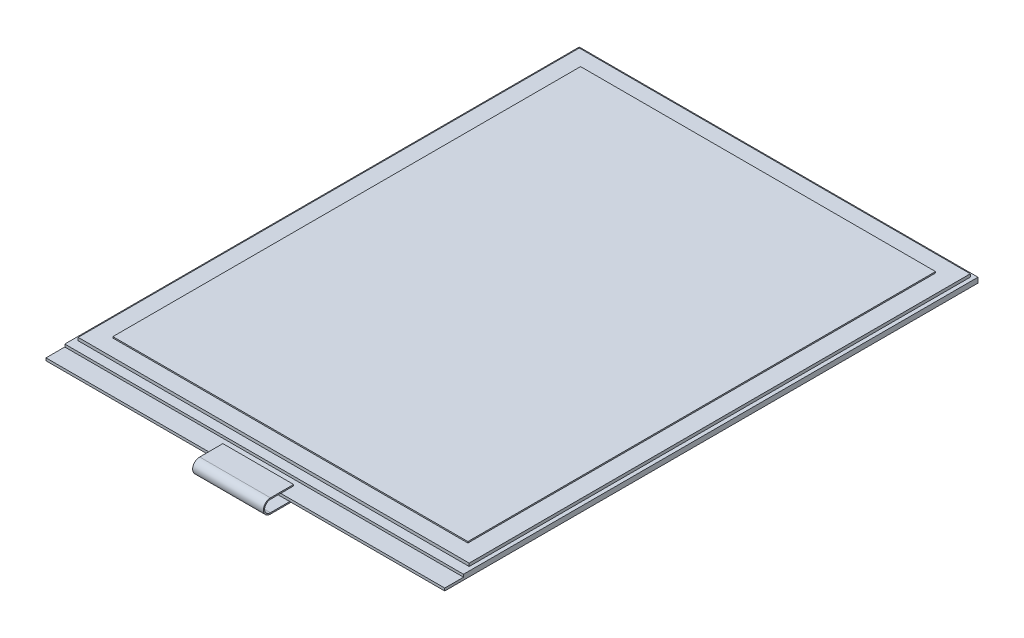
ISO-10303-21;
HEADER;
FILE_DESCRIPTION(('STEP AP214'),'2;1');
FILE_NAME('part.step','',(''),(''),'','','');
FILE_SCHEMA(('AUTOMOTIVE_DESIGN { 1 0 10303 214 1 1 1 1 }'));
ENDSEC;
DATA;
#1=APPLICATION_CONTEXT('core data for automotive mechanical design processes');
#2=APPLICATION_PROTOCOL_DEFINITION('international standard','automotive_design',2000,#1);
#3=PRODUCT_CONTEXT('',#1,'mechanical');
#4=PRODUCT('Part','Part','',(#3));
#5=PRODUCT_RELATED_PRODUCT_CATEGORY('part','',(#4));
#6=PRODUCT_DEFINITION_FORMATION('','',#4);
#7=PRODUCT_DEFINITION_CONTEXT('part definition',#1,'design');
#8=PRODUCT_DEFINITION('design','',#6,#7);
#9=PRODUCT_DEFINITION_SHAPE('','',#8);
#10=(LENGTH_UNIT() NAMED_UNIT(*) SI_UNIT(.MILLI.,.METRE.));
#11=(NAMED_UNIT(*) PLANE_ANGLE_UNIT() SI_UNIT($,.RADIAN.));
#12=(NAMED_UNIT(*) SI_UNIT($,.STERADIAN.) SOLID_ANGLE_UNIT());
#13=UNCERTAINTY_MEASURE_WITH_UNIT(LENGTH_MEASURE(1.E-05),#10,'distance_accuracy_value','');
#14=(GEOMETRIC_REPRESENTATION_CONTEXT(3) GLOBAL_UNCERTAINTY_ASSIGNED_CONTEXT((#13)) GLOBAL_UNIT_ASSIGNED_CONTEXT((#10,
#11,#12)) REPRESENTATION_CONTEXT('',''));
#15=CARTESIAN_POINT('',(0.,0.,0.));
#16=DIRECTION('',(0.,0.,1.));
#17=DIRECTION('',(1.,0.,0.));
#18=AXIS2_PLACEMENT_3D('',#15,#16,#17);
#19=CARTESIAN_POINT('',(0.,0.,0.));
#20=DIRECTION('',(0.,1.,0.));
#21=DIRECTION('',(0.,0.,1.));
#22=AXIS2_PLACEMENT_3D('',#19,#20,#21);
#23=PLANE('',#22);
#24=DIRECTION('',(0.,0.,-1.));
#25=VECTOR('',#24,1.);
#26=CARTESIAN_POINT('',(15.5,0.,-20.73));
#27=LINE('',#26,#25);
#28=CARTESIAN_POINT('',(15.5,0.,20.73));
#29=VERTEX_POINT('',#28);
#30=CARTESIAN_POINT('',(15.5,0.,-20.73));
#31=VERTEX_POINT('',#30);
#32=EDGE_CURVE('E379',#29,#31,#27,.T.);
#33=ORIENTED_EDGE('',*,*,#32,.F.);
#34=DIRECTION('',(1.,0.,0.));
#35=VECTOR('',#34,1.);
#36=CARTESIAN_POINT('',(-15.5,0.,20.73));
#37=LINE('',#36,#35);
#38=CARTESIAN_POINT('',(-15.5,0.,20.73));
#39=VERTEX_POINT('',#38);
#40=EDGE_CURVE('E383',#39,#29,#37,.T.);
#41=ORIENTED_EDGE('',*,*,#40,.F.);
#42=DIRECTION('',(0.,0.,1.));
#43=VECTOR('',#42,1.);
#44=CARTESIAN_POINT('',(-15.5,0.,-20.73));
#45=LINE('',#44,#43);
#46=CARTESIAN_POINT('',(-15.5,0.,-20.73));
#47=VERTEX_POINT('',#46);
#48=EDGE_CURVE('E395',#47,#39,#45,.T.);
#49=ORIENTED_EDGE('',*,*,#48,.F.);
#50=DIRECTION('',(-1.,0.,0.));
#51=VECTOR('',#50,1.);
#52=CARTESIAN_POINT('',(-15.5,0.,-20.73));
#53=LINE('',#52,#51);
#54=EDGE_CURVE('E393',#31,#47,#53,.T.);
#55=ORIENTED_EDGE('',*,*,#54,.F.);
#56=EDGE_LOOP('',(#33,#41,#49,#55));
#57=FACE_BOUND('',#56,.T.);
#58=DIRECTION('',(0.,0.,-1.));
#59=VECTOR('',#58,1.);
#60=CARTESIAN_POINT('',(-15.2,0.,-20.43));
#61=LINE('',#60,#59);
#62=CARTESIAN_POINT('',(-15.2,0.,18.53));
#63=VERTEX_POINT('',#62);
#64=CARTESIAN_POINT('',(-15.2,0.,-20.43));
#65=VERTEX_POINT('',#64);
#66=EDGE_CURVE('E293',#63,#65,#61,.T.);
#67=ORIENTED_EDGE('',*,*,#66,.F.);
#68=DIRECTION('',(-1.,0.,0.));
#69=VECTOR('',#68,1.);
#70=CARTESIAN_POINT('',(-15.2,0.,18.53));
#71=LINE('',#70,#69);
#72=CARTESIAN_POINT('',(15.2,0.,18.53));
#73=VERTEX_POINT('',#72);
#74=EDGE_CURVE('E298',#73,#63,#71,.T.);
#75=ORIENTED_EDGE('',*,*,#74,.F.);
#76=DIRECTION('',(0.,0.,1.));
#77=VECTOR('',#76,1.);
#78=CARTESIAN_POINT('',(15.2,0.,-20.43));
#79=LINE('',#78,#77);
#80=CARTESIAN_POINT('',(15.2,0.,-20.43));
#81=VERTEX_POINT('',#80);
#82=EDGE_CURVE('E310',#81,#73,#79,.T.);
#83=ORIENTED_EDGE('',*,*,#82,.F.);
#84=DIRECTION('',(1.,0.,0.));
#85=VECTOR('',#84,1.);
#86=CARTESIAN_POINT('',(-15.2,0.,-20.43));
#87=LINE('',#86,#85);
#88=EDGE_CURVE('E307',#65,#81,#87,.T.);
#89=ORIENTED_EDGE('',*,*,#88,.F.);
#90=EDGE_LOOP('',(#67,#75,#83,#89));
#91=FACE_BOUND('',#90,.T.);
#92=ADVANCED_FACE('F32',(#57,#91),#23,.F.);
#93=CARTESIAN_POINT('',(15.5,0.2,-20.73));
#94=DIRECTION('',(-1.,0.,0.));
#95=DIRECTION('',(0.,0.,1.));
#96=AXIS2_PLACEMENT_3D('',#93,#94,#95);
#97=PLANE('',#96);
#98=ORIENTED_EDGE('',*,*,#32,.T.);
#99=DIRECTION('',(0.,-1.,0.));
#100=VECTOR('',#99,1.);
#101=CARTESIAN_POINT('',(15.5,0.2,-20.73));
#102=LINE('',#101,#100);
#103=CARTESIAN_POINT('',(15.5,0.4,-20.73));
#104=VERTEX_POINT('',#103);
#105=EDGE_CURVE('E406',#104,#31,#102,.T.);
#106=ORIENTED_EDGE('',*,*,#105,.F.);
#107=DIRECTION('',(0.,0.,-1.));
#108=VECTOR('',#107,1.);
#109=CARTESIAN_POINT('',(15.5,0.4,-20.73));
#110=LINE('',#109,#108);
#111=CARTESIAN_POINT('',(15.5,0.4,19.27));
#112=VERTEX_POINT('',#111);
#113=EDGE_CURVE('E365',#112,#104,#110,.T.);
#114=ORIENTED_EDGE('',*,*,#113,.F.);
#115=DIRECTION('',(0.,-1.,0.));
#116=VECTOR('',#115,1.);
#117=CARTESIAN_POINT('',(15.5,0.4,19.27));
#118=LINE('',#117,#116);
#119=CARTESIAN_POINT('',(15.5,0.2,19.27));
#120=VERTEX_POINT('',#119);
#121=EDGE_CURVE('E371',#112,#120,#118,.T.);
#122=ORIENTED_EDGE('',*,*,#121,.T.);
#123=DIRECTION('',(0.,0.,-1.));
#124=VECTOR('',#123,1.);
#125=CARTESIAN_POINT('',(15.5,0.2,-20.73));
#126=LINE('',#125,#124);
#127=CARTESIAN_POINT('',(15.5,0.2,20.73));
#128=VERTEX_POINT('',#127);
#129=EDGE_CURVE('E380',#128,#120,#126,.T.);
#130=ORIENTED_EDGE('',*,*,#129,.F.);
#131=DIRECTION('',(0.,-1.,0.));
#132=VECTOR('',#131,1.);
#133=CARTESIAN_POINT('',(15.5,0.2,20.73));
#134=LINE('',#133,#132);
#135=EDGE_CURVE('E389',#128,#29,#134,.T.);
#136=ORIENTED_EDGE('',*,*,#135,.T.);
#137=EDGE_LOOP('',(#98,#106,#114,#122,#130,#136));
#138=FACE_BOUND('',#137,.T.);
#139=ADVANCED_FACE('F34',(#138),#97,.F.);
#140=CARTESIAN_POINT('',(-15.5,0.2,-20.73));
#141=DIRECTION('',(0.,0.,1.));
#142=DIRECTION('',(1.,0.,0.));
#143=AXIS2_PLACEMENT_3D('',#140,#141,#142);
#144=PLANE('',#143);
#145=ORIENTED_EDGE('',*,*,#54,.T.);
#146=DIRECTION('',(0.,-1.,0.));
#147=VECTOR('',#146,1.);
#148=CARTESIAN_POINT('',(-15.5,0.2,-20.73));
#149=LINE('',#148,#147);
#150=CARTESIAN_POINT('',(-15.5,0.4,-20.73));
#151=VERTEX_POINT('',#150);
#152=EDGE_CURVE('E403',#151,#47,#149,.T.);
#153=ORIENTED_EDGE('',*,*,#152,.F.);
#154=DIRECTION('',(-1.,0.,0.));
#155=VECTOR('',#154,1.);
#156=CARTESIAN_POINT('',(-15.5,0.4,-20.73));
#157=LINE('',#156,#155);
#158=EDGE_CURVE('E368',#104,#151,#157,.T.);
#159=ORIENTED_EDGE('',*,*,#158,.F.);
#160=ORIENTED_EDGE('',*,*,#105,.T.);
#161=EDGE_LOOP('',(#145,#153,#159,#160));
#162=FACE_BOUND('',#161,.T.);
#163=ADVANCED_FACE('F449',(#162),#144,.F.);
#164=CARTESIAN_POINT('',(-15.5,0.2,-20.73));
#165=DIRECTION('',(1.,0.,0.));
#166=DIRECTION('',(0.,0.,-1.));
#167=AXIS2_PLACEMENT_3D('',#164,#165,#166);
#168=PLANE('',#167);
#169=ORIENTED_EDGE('',*,*,#48,.T.);
#170=DIRECTION('',(0.,-1.,0.));
#171=VECTOR('',#170,1.);
#172=CARTESIAN_POINT('',(-15.5,0.2,20.73));
#173=LINE('',#172,#171);
#174=CARTESIAN_POINT('',(-15.5,0.2,20.73));
#175=VERTEX_POINT('',#174);
#176=EDGE_CURVE('E400',#175,#39,#173,.T.);
#177=ORIENTED_EDGE('',*,*,#176,.F.);
#178=DIRECTION('',(0.,0.,1.));
#179=VECTOR('',#178,1.);
#180=CARTESIAN_POINT('',(-15.5,0.2,-20.73));
#181=LINE('',#180,#179);
#182=CARTESIAN_POINT('',(-15.5,0.2,19.27));
#183=VERTEX_POINT('',#182);
#184=EDGE_CURVE('E382',#183,#175,#181,.T.);
#185=ORIENTED_EDGE('',*,*,#184,.F.);
#186=DIRECTION('',(0.,-1.,0.));
#187=VECTOR('',#186,1.);
#188=CARTESIAN_POINT('',(-15.5,0.4,19.27));
#189=LINE('',#188,#187);
#190=CARTESIAN_POINT('',(-15.5,0.4,19.27));
#191=VERTEX_POINT('',#190);
#192=EDGE_CURVE('E376',#191,#183,#189,.T.);
#193=ORIENTED_EDGE('',*,*,#192,.F.);
#194=DIRECTION('',(0.,0.,1.));
#195=VECTOR('',#194,1.);
#196=CARTESIAN_POINT('',(-15.5,0.4,-20.73));
#197=LINE('',#196,#195);
#198=EDGE_CURVE('E360',#151,#191,#197,.T.);
#199=ORIENTED_EDGE('',*,*,#198,.F.);
#200=ORIENTED_EDGE('',*,*,#152,.T.);
#201=EDGE_LOOP('',(#169,#177,#185,#193,#199,#200));
#202=FACE_BOUND('',#201,.T.);
#203=ADVANCED_FACE('F440',(#202),#168,.F.);
#204=CARTESIAN_POINT('',(-15.5,0.2,20.73));
#205=DIRECTION('',(0.,0.,-1.));
#206=DIRECTION('',(-1.,0.,0.));
#207=AXIS2_PLACEMENT_3D('',#204,#205,#206);
#208=PLANE('',#207);
#209=ORIENTED_EDGE('',*,*,#40,.T.);
#210=ORIENTED_EDGE('',*,*,#135,.F.);
#211=DIRECTION('',(1.,0.,0.));
#212=VECTOR('',#211,1.);
#213=CARTESIAN_POINT('',(-15.5,0.2,20.73));
#214=LINE('',#213,#212);
#215=CARTESIAN_POINT('',(2.75,0.2,20.73));
#216=VERTEX_POINT('',#215);
#217=EDGE_CURVE('E385',#216,#128,#214,.T.);
#218=ORIENTED_EDGE('',*,*,#217,.F.);
#219=CARTESIAN_POINT('',(-2.75,0.2,20.73));
#220=VERTEX_POINT('',#219);
#221=EDGE_CURVE('E390',#220,#216,#214,.T.);
#222=ORIENTED_EDGE('',*,*,#221,.F.);
#223=EDGE_CURVE('E386',#175,#220,#214,.T.);
#224=ORIENTED_EDGE('',*,*,#223,.F.);
#225=ORIENTED_EDGE('',*,*,#176,.T.);
#226=EDGE_LOOP('',(#209,#210,#218,#222,#224,#225));
#227=FACE_BOUND('',#226,.T.);
#228=ADVANCED_FACE('F426',(#227),#208,.F.);
#229=CARTESIAN_POINT('',(0.,0.2,0.));
#230=DIRECTION('',(0.,1.,0.));
#231=DIRECTION('',(0.,0.,1.));
#232=AXIS2_PLACEMENT_3D('',#229,#230,#231);
#233=PLANE('',#232);
#234=DIRECTION('',(0.,0.,-1.));
#235=VECTOR('',#234,1.);
#236=CARTESIAN_POINT('',(2.75,0.2,0.));
#237=LINE('',#236,#235);
#238=CARTESIAN_POINT('',(2.75,0.2,19.73));
#239=VERTEX_POINT('',#238);
#240=EDGE_CURVE('E11',#216,#239,#237,.T.);
#241=ORIENTED_EDGE('',*,*,#240,.F.);
#242=ORIENTED_EDGE('',*,*,#217,.T.);
#243=ORIENTED_EDGE('',*,*,#129,.T.);
#244=DIRECTION('',(1.,0.,0.));
#245=VECTOR('',#244,1.);
#246=CARTESIAN_POINT('',(-15.5,0.2,19.27));
#247=LINE('',#246,#245);
#248=EDGE_CURVE('E359',#183,#120,#247,.T.);
#249=ORIENTED_EDGE('',*,*,#248,.F.);
#250=ORIENTED_EDGE('',*,*,#184,.T.);
#251=ORIENTED_EDGE('',*,*,#223,.T.);
#252=DIRECTION('',(0.,0.,-1.));
#253=VECTOR('',#252,1.);
#254=CARTESIAN_POINT('',(-2.75,0.2,0.));
#255=LINE('',#254,#253);
#256=CARTESIAN_POINT('',(-2.75,0.2,19.73));
#257=VERTEX_POINT('',#256);
#258=EDGE_CURVE('E40',#220,#257,#255,.T.);
#259=ORIENTED_EDGE('',*,*,#258,.T.);
#260=DIRECTION('',(-1.,0.,0.));
#261=VECTOR('',#260,1.);
#262=CARTESIAN_POINT('',(2.75,0.2,19.73));
#263=LINE('',#262,#261);
#264=EDGE_CURVE('E291',#239,#257,#263,.T.);
#265=ORIENTED_EDGE('',*,*,#264,.F.);
#266=EDGE_LOOP('',(#241,#242,#243,#249,#250,#251,#259,#265));
#267=FACE_BOUND('',#266,.T.);
#268=ADVANCED_FACE('F412',(#267),#233,.T.);
#269=CARTESIAN_POINT('',(-15.5,0.4,19.27));
#270=DIRECTION('',(0.,0.,-1.));
#271=DIRECTION('',(-1.,0.,0.));
#272=AXIS2_PLACEMENT_3D('',#269,#270,#271);
#273=PLANE('',#272);
#274=ORIENTED_EDGE('',*,*,#248,.T.);
#275=ORIENTED_EDGE('',*,*,#121,.F.);
#276=DIRECTION('',(1.,0.,0.));
#277=VECTOR('',#276,1.);
#278=CARTESIAN_POINT('',(-15.5,0.4,19.27));
#279=LINE('',#278,#277);
#280=EDGE_CURVE('E363',#191,#112,#279,.T.);
#281=ORIENTED_EDGE('',*,*,#280,.F.);
#282=ORIENTED_EDGE('',*,*,#192,.T.);
#283=EDGE_LOOP('',(#274,#275,#281,#282));
#284=FACE_BOUND('',#283,.T.);
#285=ADVANCED_FACE('F435',(#284),#273,.F.);
#286=CARTESIAN_POINT('',(0.,0.4,0.));
#287=DIRECTION('',(0.,1.,0.));
#288=DIRECTION('',(0.,0.,1.));
#289=AXIS2_PLACEMENT_3D('',#286,#287,#288);
#290=PLANE('',#289);
#291=DIRECTION('',(0.,0.,1.));
#292=VECTOR('',#291,1.);
#293=CARTESIAN_POINT('',(-15.2,0.4,-20.43));
#294=LINE('',#293,#292);
#295=CARTESIAN_POINT('',(-15.2,0.4,-20.43));
#296=VERTEX_POINT('',#295);
#297=CARTESIAN_POINT('',(-15.2,0.4,18.53));
#298=VERTEX_POINT('',#297);
#299=EDGE_CURVE('E326',#296,#298,#294,.T.);
#300=ORIENTED_EDGE('',*,*,#299,.F.);
#301=DIRECTION('',(-1.,0.,0.));
#302=VECTOR('',#301,1.);
#303=CARTESIAN_POINT('',(-15.2,0.4,-20.43));
#304=LINE('',#303,#302);
#305=CARTESIAN_POINT('',(15.2,0.4,-20.43));
#306=VERTEX_POINT('',#305);
#307=EDGE_CURVE('E331',#306,#296,#304,.T.);
#308=ORIENTED_EDGE('',*,*,#307,.F.);
#309=DIRECTION('',(0.,0.,-1.));
#310=VECTOR('',#309,1.);
#311=CARTESIAN_POINT('',(15.2,0.4,-20.43));
#312=LINE('',#311,#310);
#313=CARTESIAN_POINT('',(15.2,0.4,18.53));
#314=VERTEX_POINT('',#313);
#315=EDGE_CURVE('E343',#314,#306,#312,.T.);
#316=ORIENTED_EDGE('',*,*,#315,.F.);
#317=DIRECTION('',(1.,0.,0.));
#318=VECTOR('',#317,1.);
#319=CARTESIAN_POINT('',(-15.2,0.4,18.53));
#320=LINE('',#319,#318);
#321=EDGE_CURVE('E340',#298,#314,#320,.T.);
#322=ORIENTED_EDGE('',*,*,#321,.F.);
#323=EDGE_LOOP('',(#300,#308,#316,#322));
#324=FACE_BOUND('',#323,.T.);
#325=ORIENTED_EDGE('',*,*,#198,.T.);
#326=ORIENTED_EDGE('',*,*,#280,.T.);
#327=ORIENTED_EDGE('',*,*,#113,.T.);
#328=ORIENTED_EDGE('',*,*,#158,.T.);
#329=EDGE_LOOP('',(#325,#326,#327,#328));
#330=FACE_BOUND('',#329,.T.);
#331=ADVANCED_FACE('F448',(#324,#330),#290,.T.);
#332=CARTESIAN_POINT('',(-15.2,0.63,-20.43));
#333=DIRECTION('',(1.,0.,0.));
#334=DIRECTION('',(0.,0.,-1.));
#335=AXIS2_PLACEMENT_3D('',#332,#333,#334);
#336=PLANE('',#335);
#337=ORIENTED_EDGE('',*,*,#299,.T.);
#338=DIRECTION('',(0.,-1.,0.));
#339=VECTOR('',#338,1.);
#340=CARTESIAN_POINT('',(-15.2,0.63,18.53));
#341=LINE('',#340,#339);
#342=CARTESIAN_POINT('',(-15.2,0.63,18.53));
#343=VERTEX_POINT('',#342);
#344=EDGE_CURVE('E356',#343,#298,#341,.T.);
#345=ORIENTED_EDGE('',*,*,#344,.F.);
#346=DIRECTION('',(0.,0.,1.));
#347=VECTOR('',#346,1.);
#348=CARTESIAN_POINT('',(-15.2,0.63,-20.43));
#349=LINE('',#348,#347);
#350=CARTESIAN_POINT('',(-15.2,0.63,-20.43));
#351=VERTEX_POINT('',#350);
#352=EDGE_CURVE('E327',#351,#343,#349,.T.);
#353=ORIENTED_EDGE('',*,*,#352,.F.);
#354=DIRECTION('',(0.,-1.,0.));
#355=VECTOR('',#354,1.);
#356=CARTESIAN_POINT('',(-15.2,0.63,-20.43));
#357=LINE('',#356,#355);
#358=EDGE_CURVE('E337',#351,#296,#357,.T.);
#359=ORIENTED_EDGE('',*,*,#358,.T.);
#360=EDGE_LOOP('',(#337,#345,#353,#359));
#361=FACE_BOUND('',#360,.T.);
#362=ADVANCED_FACE('F473',(#361),#336,.F.);
#363=CARTESIAN_POINT('',(-15.2,0.63,18.53));
#364=DIRECTION('',(0.,0.,-1.));
#365=DIRECTION('',(-1.,0.,0.));
#366=AXIS2_PLACEMENT_3D('',#363,#364,#365);
#367=PLANE('',#366);
#368=ORIENTED_EDGE('',*,*,#321,.T.);
#369=DIRECTION('',(0.,-1.,0.));
#370=VECTOR('',#369,1.);
#371=CARTESIAN_POINT('',(15.2,0.63,18.53));
#372=LINE('',#371,#370);
#373=CARTESIAN_POINT('',(15.2,0.63,18.53));
#374=VERTEX_POINT('',#373);
#375=EDGE_CURVE('E353',#374,#314,#372,.T.);
#376=ORIENTED_EDGE('',*,*,#375,.F.);
#377=DIRECTION('',(1.,0.,0.));
#378=VECTOR('',#377,1.);
#379=CARTESIAN_POINT('',(-15.2,0.63,18.53));
#380=LINE('',#379,#378);
#381=EDGE_CURVE('E330',#343,#374,#380,.T.);
#382=ORIENTED_EDGE('',*,*,#381,.F.);
#383=ORIENTED_EDGE('',*,*,#344,.T.);
#384=EDGE_LOOP('',(#368,#376,#382,#383));
#385=FACE_BOUND('',#384,.T.);
#386=ADVANCED_FACE('F479',(#385),#367,.F.);
#387=CARTESIAN_POINT('',(15.2,0.63,-20.43));
#388=DIRECTION('',(-1.,0.,0.));
#389=DIRECTION('',(0.,0.,1.));
#390=AXIS2_PLACEMENT_3D('',#387,#388,#389);
#391=PLANE('',#390);
#392=ORIENTED_EDGE('',*,*,#315,.T.);
#393=DIRECTION('',(0.,-1.,0.));
#394=VECTOR('',#393,1.);
#395=CARTESIAN_POINT('',(15.2,0.63,-20.43));
#396=LINE('',#395,#394);
#397=CARTESIAN_POINT('',(15.2,0.63,-20.43));
#398=VERTEX_POINT('',#397);
#399=EDGE_CURVE('E350',#398,#306,#396,.T.);
#400=ORIENTED_EDGE('',*,*,#399,.F.);
#401=DIRECTION('',(0.,0.,-1.));
#402=VECTOR('',#401,1.);
#403=CARTESIAN_POINT('',(15.2,0.63,-20.43));
#404=LINE('',#403,#402);
#405=EDGE_CURVE('E333',#374,#398,#404,.T.);
#406=ORIENTED_EDGE('',*,*,#405,.F.);
#407=ORIENTED_EDGE('',*,*,#375,.T.);
#408=EDGE_LOOP('',(#392,#400,#406,#407));
#409=FACE_BOUND('',#408,.T.);
#410=ADVANCED_FACE('F483',(#409),#391,.F.);
#411=CARTESIAN_POINT('',(-15.2,0.63,-20.43));
#412=DIRECTION('',(0.,0.,1.));
#413=DIRECTION('',(1.,0.,0.));
#414=AXIS2_PLACEMENT_3D('',#411,#412,#413);
#415=PLANE('',#414);
#416=ORIENTED_EDGE('',*,*,#307,.T.);
#417=ORIENTED_EDGE('',*,*,#358,.F.);
#418=DIRECTION('',(-1.,0.,0.));
#419=VECTOR('',#418,1.);
#420=CARTESIAN_POINT('',(-15.2,0.63,-20.43));
#421=LINE('',#420,#419);
#422=EDGE_CURVE('E335',#398,#351,#421,.T.);
#423=ORIENTED_EDGE('',*,*,#422,.F.);
#424=ORIENTED_EDGE('',*,*,#399,.T.);
#425=EDGE_LOOP('',(#416,#417,#423,#424));
#426=FACE_BOUND('',#425,.T.);
#427=ADVANCED_FACE('F487',(#426),#415,.F.);
#428=CARTESIAN_POINT('',(0.,0.63,0.));
#429=DIRECTION('',(0.,1.,0.));
#430=DIRECTION('',(0.,0.,1.));
#431=AXIS2_PLACEMENT_3D('',#428,#429,#430);
#432=PLANE('',#431);
#433=DIRECTION('',(0.,0.,-1.));
#434=VECTOR('',#433,1.);
#435=CARTESIAN_POINT('',(13.8,0.63,-19.13));
#436=LINE('',#435,#434);
#437=CARTESIAN_POINT('',(13.8,0.63,17.23));
#438=VERTEX_POINT('',#437);
#439=CARTESIAN_POINT('',(13.8,0.63,-19.13));
#440=VERTEX_POINT('',#439);
#441=EDGE_CURVE('E47',#438,#440,#436,.T.);
#442=ORIENTED_EDGE('',*,*,#441,.F.);
#443=DIRECTION('',(1.,0.,0.));
#444=VECTOR('',#443,1.);
#445=CARTESIAN_POINT('',(-13.8,0.63,17.23));
#446=LINE('',#445,#444);
#447=CARTESIAN_POINT('',(-13.8,0.63,17.23));
#448=VERTEX_POINT('',#447);
#449=EDGE_CURVE('E51',#448,#438,#446,.T.);
#450=ORIENTED_EDGE('',*,*,#449,.F.);
#451=DIRECTION('',(0.,0.,1.));
#452=VECTOR('',#451,1.);
#453=CARTESIAN_POINT('',(-13.8,0.63,-19.13));
#454=LINE('',#453,#452);
#455=CARTESIAN_POINT('',(-13.8,0.63,-19.13));
#456=VERTEX_POINT('',#455);
#457=EDGE_CURVE('E767',#456,#448,#454,.T.);
#458=ORIENTED_EDGE('',*,*,#457,.F.);
#459=DIRECTION('',(-1.,0.,0.));
#460=VECTOR('',#459,1.);
#461=CARTESIAN_POINT('',(-13.8,0.63,-19.13));
#462=LINE('',#461,#460);
#463=EDGE_CURVE('E773',#440,#456,#462,.T.);
#464=ORIENTED_EDGE('',*,*,#463,.F.);
#465=EDGE_LOOP('',(#442,#450,#458,#464));
#466=FACE_BOUND('',#465,.T.);
#467=ORIENTED_EDGE('',*,*,#352,.T.);
#468=ORIENTED_EDGE('',*,*,#381,.T.);
#469=ORIENTED_EDGE('',*,*,#405,.T.);
#470=ORIENTED_EDGE('',*,*,#422,.T.);
#471=EDGE_LOOP('',(#467,#468,#469,#470));
#472=FACE_BOUND('',#471,.T.);
#473=ADVANCED_FACE('F491',(#466,#472),#432,.T.);
#474=CARTESIAN_POINT('',(-15.2,-0.115,-20.43));
#475=DIRECTION('',(1.,0.,0.));
#476=DIRECTION('',(0.,0.,-1.));
#477=AXIS2_PLACEMENT_3D('',#474,#475,#476);
#478=PLANE('',#477);
#479=ORIENTED_EDGE('',*,*,#66,.T.);
#480=DIRECTION('',(0.,1.,0.));
#481=VECTOR('',#480,1.);
#482=CARTESIAN_POINT('',(-15.2,-0.115,-20.43));
#483=LINE('',#482,#481);
#484=CARTESIAN_POINT('',(-15.2,-0.115,-20.43));
#485=VERTEX_POINT('',#484);
#486=EDGE_CURVE('E323',#485,#65,#483,.T.);
#487=ORIENTED_EDGE('',*,*,#486,.F.);
#488=DIRECTION('',(0.,0.,-1.));
#489=VECTOR('',#488,1.);
#490=CARTESIAN_POINT('',(-15.2,-0.115,-20.43));
#491=LINE('',#490,#489);
#492=CARTESIAN_POINT('',(-15.2,-0.115,18.53));
#493=VERTEX_POINT('',#492);
#494=EDGE_CURVE('E294',#493,#485,#491,.T.);
#495=ORIENTED_EDGE('',*,*,#494,.F.);
#496=DIRECTION('',(0.,1.,0.));
#497=VECTOR('',#496,1.);
#498=CARTESIAN_POINT('',(-15.2,-0.115,18.53));
#499=LINE('',#498,#497);
#500=EDGE_CURVE('E304',#493,#63,#499,.T.);
#501=ORIENTED_EDGE('',*,*,#500,.T.);
#502=EDGE_LOOP('',(#479,#487,#495,#501));
#503=FACE_BOUND('',#502,.T.);
#504=ADVANCED_FACE('F495',(#503),#478,.F.);
#505=CARTESIAN_POINT('',(-15.2,-0.115,-20.43));
#506=DIRECTION('',(0.,0.,1.));
#507=DIRECTION('',(1.,0.,0.));
#508=AXIS2_PLACEMENT_3D('',#505,#506,#507);
#509=PLANE('',#508);
#510=ORIENTED_EDGE('',*,*,#88,.T.);
#511=DIRECTION('',(0.,1.,0.));
#512=VECTOR('',#511,1.);
#513=CARTESIAN_POINT('',(15.2,-0.115,-20.43));
#514=LINE('',#513,#512);
#515=CARTESIAN_POINT('',(15.2,-0.115,-20.43));
#516=VERTEX_POINT('',#515);
#517=EDGE_CURVE('E320',#516,#81,#514,.T.);
#518=ORIENTED_EDGE('',*,*,#517,.F.);
#519=DIRECTION('',(1.,0.,0.));
#520=VECTOR('',#519,1.);
#521=CARTESIAN_POINT('',(-15.2,-0.115,-20.43));
#522=LINE('',#521,#520);
#523=EDGE_CURVE('E297',#485,#516,#522,.T.);
#524=ORIENTED_EDGE('',*,*,#523,.F.);
#525=ORIENTED_EDGE('',*,*,#486,.T.);
#526=EDGE_LOOP('',(#510,#518,#524,#525));
#527=FACE_BOUND('',#526,.T.);
#528=ADVANCED_FACE('F498',(#527),#509,.F.);
#529=CARTESIAN_POINT('',(15.2,-0.115,-20.43));
#530=DIRECTION('',(-1.,0.,0.));
#531=DIRECTION('',(0.,0.,1.));
#532=AXIS2_PLACEMENT_3D('',#529,#530,#531);
#533=PLANE('',#532);
#534=ORIENTED_EDGE('',*,*,#82,.T.);
#535=DIRECTION('',(0.,1.,0.));
#536=VECTOR('',#535,1.);
#537=CARTESIAN_POINT('',(15.2,-0.115,18.53));
#538=LINE('',#537,#536);
#539=CARTESIAN_POINT('',(15.2,-0.115,18.53));
#540=VERTEX_POINT('',#539);
#541=EDGE_CURVE('E317',#540,#73,#538,.T.);
#542=ORIENTED_EDGE('',*,*,#541,.F.);
#543=DIRECTION('',(0.,0.,1.));
#544=VECTOR('',#543,1.);
#545=CARTESIAN_POINT('',(15.2,-0.115,-20.43));
#546=LINE('',#545,#544);
#547=EDGE_CURVE('E300',#516,#540,#546,.T.);
#548=ORIENTED_EDGE('',*,*,#547,.F.);
#549=ORIENTED_EDGE('',*,*,#517,.T.);
#550=EDGE_LOOP('',(#534,#542,#548,#549));
#551=FACE_BOUND('',#550,.T.);
#552=ADVANCED_FACE('F502',(#551),#533,.F.);
#553=CARTESIAN_POINT('',(-15.2,-0.115,18.53));
#554=DIRECTION('',(0.,0.,-1.));
#555=DIRECTION('',(-1.,0.,0.));
#556=AXIS2_PLACEMENT_3D('',#553,#554,#555);
#557=PLANE('',#556);
#558=ORIENTED_EDGE('',*,*,#74,.T.);
#559=ORIENTED_EDGE('',*,*,#500,.F.);
#560=DIRECTION('',(-1.,0.,0.));
#561=VECTOR('',#560,1.);
#562=CARTESIAN_POINT('',(-15.2,-0.115,18.53));
#563=LINE('',#562,#561);
#564=EDGE_CURVE('E302',#540,#493,#563,.T.);
#565=ORIENTED_EDGE('',*,*,#564,.F.);
#566=ORIENTED_EDGE('',*,*,#541,.T.);
#567=EDGE_LOOP('',(#558,#559,#565,#566));
#568=FACE_BOUND('',#567,.T.);
#569=ADVANCED_FACE('F506',(#568),#557,.F.);
#570=CARTESIAN_POINT('',(0.,-0.115,0.));
#571=DIRECTION('',(0.,1.,0.));
#572=DIRECTION('',(0.,0.,1.));
#573=AXIS2_PLACEMENT_3D('',#570,#571,#572);
#574=PLANE('',#573);
#575=ORIENTED_EDGE('',*,*,#494,.T.);
#576=ORIENTED_EDGE('',*,*,#523,.T.);
#577=ORIENTED_EDGE('',*,*,#547,.T.);
#578=ORIENTED_EDGE('',*,*,#564,.T.);
#579=EDGE_LOOP('',(#575,#576,#577,#578));
#580=FACE_BOUND('',#579,.T.);
#581=ADVANCED_FACE('F510',(#580),#574,.F.);
#582=CARTESIAN_POINT('',(2.75,0.2,20.73));
#583=DIRECTION('',(0.,1.,0.));
#584=DIRECTION('',(0.,0.,1.));
#585=AXIS2_PLACEMENT_3D('',#582,#583,#584);
#586=PLANE('',#585);
#587=DIRECTION('',(0.,0.,-1.));
#588=VECTOR('',#587,1.);
#589=CARTESIAN_POINT('',(-2.75,0.2,20.73));
#590=LINE('',#589,#588);
#591=CARTESIAN_POINT('',(-2.75,0.2,21.53));
#592=VERTEX_POINT('',#591);
#593=EDGE_CURVE('E242',#592,#220,#590,.T.);
#594=ORIENTED_EDGE('',*,*,#593,.T.);
#595=ORIENTED_EDGE('',*,*,#221,.T.);
#596=DIRECTION('',(0.,0.,-1.));
#597=VECTOR('',#596,1.);
#598=CARTESIAN_POINT('',(2.75,0.2,19.73));
#599=LINE('',#598,#597);
#600=CARTESIAN_POINT('',(2.75,0.2,21.53));
#601=VERTEX_POINT('',#600);
#602=EDGE_CURVE('E238',#601,#216,#599,.T.);
#603=ORIENTED_EDGE('',*,*,#602,.F.);
#604=DIRECTION('',(-1.,0.,0.));
#605=VECTOR('',#604,1.);
#606=CARTESIAN_POINT('',(2.75,0.2,21.53));
#607=LINE('',#606,#605);
#608=EDGE_CURVE('E256',#601,#592,#607,.T.);
#609=ORIENTED_EDGE('',*,*,#608,.T.);
#610=EDGE_LOOP('',(#594,#595,#603,#609));
#611=FACE_BOUND('',#610,.T.);
#612=ADVANCED_FACE('F422',(#611),#586,.F.);
#613=CARTESIAN_POINT('',(2.75,0.299999999999961,19.73));
#614=DIRECTION('',(0.,0.,1.));
#615=DIRECTION('',(0.,-1.,0.));
#616=AXIS2_PLACEMENT_3D('',#613,#614,#615);
#617=PLANE('',#616);
#618=DIRECTION('',(0.,1.,0.));
#619=VECTOR('',#618,1.);
#620=CARTESIAN_POINT('',(-2.75,0.299999999999961,19.73));
#621=LINE('',#620,#619);
#622=CARTESIAN_POINT('',(-2.75,0.299999999999961,19.73));
#623=VERTEX_POINT('',#622);
#624=EDGE_CURVE('E230',#257,#623,#621,.T.);
#625=ORIENTED_EDGE('',*,*,#624,.T.);
#626=DIRECTION('',(-1.,0.,0.));
#627=VECTOR('',#626,1.);
#628=CARTESIAN_POINT('',(2.75,0.299999999999961,19.73));
#629=LINE('',#628,#627);
#630=CARTESIAN_POINT('',(2.75,0.299999999999961,19.73));
#631=VERTEX_POINT('',#630);
#632=EDGE_CURVE('E288',#631,#623,#629,.T.);
#633=ORIENTED_EDGE('',*,*,#632,.F.);
#634=DIRECTION('',(0.,1.,0.));
#635=VECTOR('',#634,1.);
#636=CARTESIAN_POINT('',(2.75,0.299999999999961,19.73));
#637=LINE('',#636,#635);
#638=EDGE_CURVE('E241',#239,#631,#637,.T.);
#639=ORIENTED_EDGE('',*,*,#638,.F.);
#640=ORIENTED_EDGE('',*,*,#264,.T.);
#641=EDGE_LOOP('',(#625,#633,#639,#640));
#642=FACE_BOUND('',#641,.T.);
#643=ADVANCED_FACE('F515',(#642),#617,.F.);
#644=CARTESIAN_POINT('',(2.75,0.299999999999961,21.53));
#645=DIRECTION('',(0.,-1.,0.));
#646=DIRECTION('',(0.,0.,-1.));
#647=AXIS2_PLACEMENT_3D('',#644,#645,#646);
#648=PLANE('',#647);
#649=DIRECTION('',(0.,0.,1.));
#650=VECTOR('',#649,1.);
#651=CARTESIAN_POINT('',(-2.75,0.299999999999961,21.53));
#652=LINE('',#651,#650);
#653=CARTESIAN_POINT('',(-2.75,0.299999999999961,21.53));
#654=VERTEX_POINT('',#653);
#655=EDGE_CURVE('E232',#623,#654,#652,.T.);
#656=ORIENTED_EDGE('',*,*,#655,.T.);
#657=DIRECTION('',(-1.,0.,0.));
#658=VECTOR('',#657,1.);
#659=CARTESIAN_POINT('',(2.75,0.299999999999961,21.53));
#660=LINE('',#659,#658);
#661=CARTESIAN_POINT('',(2.75,0.299999999999961,21.53));
#662=VERTEX_POINT('',#661);
#663=EDGE_CURVE('E285',#662,#654,#660,.T.);
#664=ORIENTED_EDGE('',*,*,#663,.F.);
#665=DIRECTION('',(0.,0.,1.));
#666=VECTOR('',#665,1.);
#667=CARTESIAN_POINT('',(2.75,0.299999999999961,21.53));
#668=LINE('',#667,#666);
#669=EDGE_CURVE('E244',#631,#662,#668,.T.);
#670=ORIENTED_EDGE('',*,*,#669,.F.);
#671=ORIENTED_EDGE('',*,*,#632,.T.);
#672=EDGE_LOOP('',(#656,#664,#670,#671));
#673=FACE_BOUND('',#672,.T.);
#674=ADVANCED_FACE('F518',(#673),#648,.F.);
#675=CARTESIAN_POINT('',(2.75,-0.25,21.53));
#676=DIRECTION('',(-1.,0.,0.));
#677=DIRECTION('',(0.,0.,1.));
#678=AXIS2_PLACEMENT_3D('',#675,#676,#677);
#679=CYLINDRICAL_SURFACE('',#678,0.549999999999962);
#680=CARTESIAN_POINT('',(-2.75,-0.25,21.53));
#681=DIRECTION('',(1.,0.,0.));
#682=DIRECTION('',(0.,0.,-1.));
#683=AXIS2_PLACEMENT_3D('',#680,#681,#682);
#684=CIRCLE('',#683,0.549999999999962);
#685=CARTESIAN_POINT('',(-2.75,-0.799999999999962,21.53));
#686=VERTEX_POINT('',#685);
#687=EDGE_CURVE('E259',#654,#686,#684,.T.);
#688=ORIENTED_EDGE('',*,*,#687,.T.);
#689=DIRECTION('',(-1.,0.,0.));
#690=VECTOR('',#689,1.);
#691=CARTESIAN_POINT('',(2.75,-0.799999999999962,21.53));
#692=LINE('',#691,#690);
#693=CARTESIAN_POINT('',(2.75,-0.799999999999962,21.53));
#694=VERTEX_POINT('',#693);
#695=EDGE_CURVE('E282',#694,#686,#692,.T.);
#696=ORIENTED_EDGE('',*,*,#695,.F.);
#697=CARTESIAN_POINT('',(2.75,-0.25,21.53));
#698=DIRECTION('',(1.,0.,0.));
#699=DIRECTION('',(0.,0.,-1.));
#700=AXIS2_PLACEMENT_3D('',#697,#698,#699);
#701=CIRCLE('',#700,0.549999999999962);
#702=EDGE_CURVE('E246',#662,#694,#701,.T.);
#703=ORIENTED_EDGE('',*,*,#702,.F.);
#704=ORIENTED_EDGE('',*,*,#663,.T.);
#705=EDGE_LOOP('',(#688,#696,#703,#704));
#706=FACE_BOUND('',#705,.T.);
#707=ADVANCED_FACE('F522',(#706),#679,.T.);
#708=CARTESIAN_POINT('',(2.75,-0.8,10.13));
#709=DIRECTION('',(0.,1.,0.));
#710=DIRECTION('',(0.,0.,1.));
#711=AXIS2_PLACEMENT_3D('',#708,#709,#710);
#712=PLANE('',#711);
#713=DIRECTION('',(0.,0.,-1.));
#714=VECTOR('',#713,1.);
#715=CARTESIAN_POINT('',(-2.75,-0.8,10.13));
#716=LINE('',#715,#714);
#717=CARTESIAN_POINT('',(-2.75,-0.8,10.13));
#718=VERTEX_POINT('',#717);
#719=EDGE_CURVE('E261',#686,#718,#716,.T.);
#720=ORIENTED_EDGE('',*,*,#719,.T.);
#721=DIRECTION('',(-1.,0.,0.));
#722=VECTOR('',#721,1.);
#723=CARTESIAN_POINT('',(2.75,-0.8,10.13));
#724=LINE('',#723,#722);
#725=CARTESIAN_POINT('',(2.75,-0.8,10.13));
#726=VERTEX_POINT('',#725);
#727=EDGE_CURVE('E279',#726,#718,#724,.T.);
#728=ORIENTED_EDGE('',*,*,#727,.F.);
#729=DIRECTION('',(0.,0.,-1.));
#730=VECTOR('',#729,1.);
#731=CARTESIAN_POINT('',(2.75,-0.8,10.13));
#732=LINE('',#731,#730);
#733=EDGE_CURVE('E248',#694,#726,#732,.T.);
#734=ORIENTED_EDGE('',*,*,#733,.F.);
#735=ORIENTED_EDGE('',*,*,#695,.T.);
#736=EDGE_LOOP('',(#720,#728,#734,#735));
#737=FACE_BOUND('',#736,.T.);
#738=ADVANCED_FACE('F526',(#737),#712,.F.);
#739=CARTESIAN_POINT('',(2.75,-0.7,10.13));
#740=DIRECTION('',(0.,0.,1.));
#741=DIRECTION('',(1.,0.,0.));
#742=AXIS2_PLACEMENT_3D('',#739,#740,#741);
#743=PLANE('',#742);
#744=DIRECTION('',(0.,1.,0.));
#745=VECTOR('',#744,1.);
#746=CARTESIAN_POINT('',(-2.75,-0.7,10.13));
#747=LINE('',#746,#745);
#748=CARTESIAN_POINT('',(-2.75,-0.7,10.13));
#749=VERTEX_POINT('',#748);
#750=EDGE_CURVE('E263',#718,#749,#747,.T.);
#751=ORIENTED_EDGE('',*,*,#750,.T.);
#752=DIRECTION('',(-1.,0.,0.));
#753=VECTOR('',#752,1.);
#754=CARTESIAN_POINT('',(2.75,-0.7,10.13));
#755=LINE('',#754,#753);
#756=CARTESIAN_POINT('',(2.75,-0.7,10.13));
#757=VERTEX_POINT('',#756);
#758=EDGE_CURVE('E276',#757,#749,#755,.T.);
#759=ORIENTED_EDGE('',*,*,#758,.F.);
#760=DIRECTION('',(0.,1.,0.));
#761=VECTOR('',#760,1.);
#762=CARTESIAN_POINT('',(2.75,-0.7,10.13));
#763=LINE('',#762,#761);
#764=EDGE_CURVE('E250',#726,#757,#763,.T.);
#765=ORIENTED_EDGE('',*,*,#764,.F.);
#766=ORIENTED_EDGE('',*,*,#727,.T.);
#767=EDGE_LOOP('',(#751,#759,#765,#766));
#768=FACE_BOUND('',#767,.T.);
#769=ADVANCED_FACE('F530',(#768),#743,.F.);
#770=CARTESIAN_POINT('',(2.75,-0.699999999999999,21.53));
#771=DIRECTION('',(0.,-1.,0.));
#772=DIRECTION('',(0.,0.,-1.));
#773=AXIS2_PLACEMENT_3D('',#770,#771,#772);
#774=PLANE('',#773);
#775=DIRECTION('',(0.,0.,1.));
#776=VECTOR('',#775,1.);
#777=CARTESIAN_POINT('',(-2.75,-0.699999999999999,21.53));
#778=LINE('',#777,#776);
#779=CARTESIAN_POINT('',(-2.75,-0.699999999999999,21.53));
#780=VERTEX_POINT('',#779);
#781=EDGE_CURVE('E265',#749,#780,#778,.T.);
#782=ORIENTED_EDGE('',*,*,#781,.T.);
#783=DIRECTION('',(-1.,0.,0.));
#784=VECTOR('',#783,1.);
#785=CARTESIAN_POINT('',(2.75,-0.699999999999999,21.53));
#786=LINE('',#785,#784);
#787=CARTESIAN_POINT('',(2.75,-0.699999999999999,21.53));
#788=VERTEX_POINT('',#787);
#789=EDGE_CURVE('E273',#788,#780,#786,.T.);
#790=ORIENTED_EDGE('',*,*,#789,.F.);
#791=DIRECTION('',(0.,0.,1.));
#792=VECTOR('',#791,1.);
#793=CARTESIAN_POINT('',(2.75,-0.699999999999999,21.53));
#794=LINE('',#793,#792);
#795=EDGE_CURVE('E252',#757,#788,#794,.T.);
#796=ORIENTED_EDGE('',*,*,#795,.F.);
#797=ORIENTED_EDGE('',*,*,#758,.T.);
#798=EDGE_LOOP('',(#782,#790,#796,#797));
#799=FACE_BOUND('',#798,.T.);
#800=ADVANCED_FACE('F534',(#799),#774,.F.);
#801=CARTESIAN_POINT('',(2.75,-0.25,21.53));
#802=DIRECTION('',(-1.,0.,0.));
#803=DIRECTION('',(0.,0.,1.));
#804=AXIS2_PLACEMENT_3D('',#801,#802,#803);
#805=CYLINDRICAL_SURFACE('',#804,0.449999999999999);
#806=CARTESIAN_POINT('',(-2.75,-0.25,21.53));
#807=DIRECTION('',(-1.,0.,0.));
#808=DIRECTION('',(0.,0.,-1.));
#809=AXIS2_PLACEMENT_3D('',#806,#807,#808);
#810=CIRCLE('',#809,0.449999999999999);
#811=EDGE_CURVE('E267',#780,#592,#810,.T.);
#812=ORIENTED_EDGE('',*,*,#811,.T.);
#813=ORIENTED_EDGE('',*,*,#608,.F.);
#814=CARTESIAN_POINT('',(2.75,-0.25,21.53));
#815=DIRECTION('',(-1.,0.,0.));
#816=DIRECTION('',(0.,0.,-1.));
#817=AXIS2_PLACEMENT_3D('',#814,#815,#816);
#818=CIRCLE('',#817,0.449999999999999);
#819=EDGE_CURVE('E254',#788,#601,#818,.T.);
#820=ORIENTED_EDGE('',*,*,#819,.F.);
#821=ORIENTED_EDGE('',*,*,#789,.T.);
#822=EDGE_LOOP('',(#812,#813,#820,#821));
#823=FACE_BOUND('',#822,.T.);
#824=ADVANCED_FACE('F538',(#823),#805,.F.);
#825=CARTESIAN_POINT('',(2.75,-0.25,21.53));
#826=DIRECTION('',(1.,0.,0.));
#827=DIRECTION('',(0.,0.,-1.));
#828=AXIS2_PLACEMENT_3D('',#825,#826,#827);
#829=PLANE('',#828);
#830=ORIENTED_EDGE('',*,*,#602,.T.);
#831=ORIENTED_EDGE('',*,*,#240,.T.);
#832=ORIENTED_EDGE('',*,*,#638,.T.);
#833=ORIENTED_EDGE('',*,*,#669,.T.);
#834=ORIENTED_EDGE('',*,*,#702,.T.);
#835=ORIENTED_EDGE('',*,*,#733,.T.);
#836=ORIENTED_EDGE('',*,*,#764,.T.);
#837=ORIENTED_EDGE('',*,*,#795,.T.);
#838=ORIENTED_EDGE('',*,*,#819,.T.);
#839=EDGE_LOOP('',(#830,#831,#832,#833,#834,#835,#836,#837,#838));
#840=FACE_BOUND('',#839,.T.);
#841=ADVANCED_FACE('F542',(#840),#829,.T.);
#842=CARTESIAN_POINT('',(-2.75,-0.25,21.53));
#843=DIRECTION('',(1.,0.,0.));
#844=DIRECTION('',(0.,0.,-1.));
#845=AXIS2_PLACEMENT_3D('',#842,#843,#844);
#846=PLANE('',#845);
#847=ORIENTED_EDGE('',*,*,#624,.F.);
#848=ORIENTED_EDGE('',*,*,#258,.F.);
#849=ORIENTED_EDGE('',*,*,#593,.F.);
#850=ORIENTED_EDGE('',*,*,#811,.F.);
#851=ORIENTED_EDGE('',*,*,#781,.F.);
#852=ORIENTED_EDGE('',*,*,#750,.F.);
#853=ORIENTED_EDGE('',*,*,#719,.F.);
#854=ORIENTED_EDGE('',*,*,#687,.F.);
#855=ORIENTED_EDGE('',*,*,#655,.F.);
#856=EDGE_LOOP('',(#847,#848,#849,#850,#851,#852,#853,#854,#855));
#857=FACE_BOUND('',#856,.T.);
#858=ADVANCED_FACE('F417',(#857),#846,.F.);
#859=CARTESIAN_POINT('',(13.8,0.73,-19.13));
#860=DIRECTION('',(-1.,0.,0.));
#861=DIRECTION('',(0.,0.,1.));
#862=AXIS2_PLACEMENT_3D('',#859,#860,#861);
#863=PLANE('',#862);
#864=ORIENTED_EDGE('',*,*,#441,.T.);
#865=DIRECTION('',(0.,-1.,0.));
#866=VECTOR('',#865,1.);
#867=CARTESIAN_POINT('',(13.8,0.73,-19.13));
#868=LINE('',#867,#866);
#869=CARTESIAN_POINT('',(13.8,0.73,-19.13));
#870=VERTEX_POINT('',#869);
#871=EDGE_CURVE('E213',#870,#440,#868,.T.);
#872=ORIENTED_EDGE('',*,*,#871,.F.);
#873=DIRECTION('',(0.,0.,-1.));
#874=VECTOR('',#873,1.);
#875=CARTESIAN_POINT('',(13.8,0.73,-19.13));
#876=LINE('',#875,#874);
#877=CARTESIAN_POINT('',(13.8,0.73,17.23));
#878=VERTEX_POINT('',#877);
#879=EDGE_CURVE('E219',#878,#870,#876,.T.);
#880=ORIENTED_EDGE('',*,*,#879,.F.);
#881=DIRECTION('',(0.,-1.,0.));
#882=VECTOR('',#881,1.);
#883=CARTESIAN_POINT('',(13.8,0.73,17.23));
#884=LINE('',#883,#882);
#885=EDGE_CURVE('E765',#878,#438,#884,.T.);
#886=ORIENTED_EDGE('',*,*,#885,.T.);
#887=EDGE_LOOP('',(#864,#872,#880,#886));
#888=FACE_BOUND('',#887,.T.);
#889=ADVANCED_FACE('F229',(#888),#863,.F.);
#890=CARTESIAN_POINT('',(-13.8,0.73,-19.13));
#891=DIRECTION('',(0.,0.,1.));
#892=DIRECTION('',(1.,0.,0.));
#893=AXIS2_PLACEMENT_3D('',#890,#891,#892);
#894=PLANE('',#893);
#895=ORIENTED_EDGE('',*,*,#463,.T.);
#896=DIRECTION('',(0.,-1.,0.));
#897=VECTOR('',#896,1.);
#898=CARTESIAN_POINT('',(-13.8,0.73,-19.13));
#899=LINE('',#898,#897);
#900=CARTESIAN_POINT('',(-13.8,0.73,-19.13));
#901=VERTEX_POINT('',#900);
#902=EDGE_CURVE('E215',#901,#456,#899,.T.);
#903=ORIENTED_EDGE('',*,*,#902,.F.);
#904=DIRECTION('',(-1.,0.,0.));
#905=VECTOR('',#904,1.);
#906=CARTESIAN_POINT('',(-13.8,0.73,-19.13));
#907=LINE('',#906,#905);
#908=EDGE_CURVE('E208',#870,#901,#907,.T.);
#909=ORIENTED_EDGE('',*,*,#908,.F.);
#910=ORIENTED_EDGE('',*,*,#871,.T.);
#911=EDGE_LOOP('',(#895,#903,#909,#910));
#912=FACE_BOUND('',#911,.T.);
#913=ADVANCED_FACE('F211',(#912),#894,.F.);
#914=CARTESIAN_POINT('',(-13.8,0.73,-19.13));
#915=DIRECTION('',(1.,0.,0.));
#916=DIRECTION('',(0.,0.,-1.));
#917=AXIS2_PLACEMENT_3D('',#914,#915,#916);
#918=PLANE('',#917);
#919=ORIENTED_EDGE('',*,*,#457,.T.);
#920=DIRECTION('',(0.,-1.,0.));
#921=VECTOR('',#920,1.);
#922=CARTESIAN_POINT('',(-13.8,0.73,17.23));
#923=LINE('',#922,#921);
#924=CARTESIAN_POINT('',(-13.8,0.73,17.23));
#925=VERTEX_POINT('',#924);
#926=EDGE_CURVE('E234',#925,#448,#923,.T.);
#927=ORIENTED_EDGE('',*,*,#926,.F.);
#928=DIRECTION('',(0.,0.,1.));
#929=VECTOR('',#928,1.);
#930=CARTESIAN_POINT('',(-13.8,0.73,-19.13));
#931=LINE('',#930,#929);
#932=EDGE_CURVE('E218',#901,#925,#931,.T.);
#933=ORIENTED_EDGE('',*,*,#932,.F.);
#934=ORIENTED_EDGE('',*,*,#902,.T.);
#935=EDGE_LOOP('',(#919,#927,#933,#934));
#936=FACE_BOUND('',#935,.T.);
#937=ADVANCED_FACE('F555',(#936),#918,.F.);
#938=CARTESIAN_POINT('',(-13.8,0.73,17.23));
#939=DIRECTION('',(0.,0.,-1.));
#940=DIRECTION('',(-1.,0.,0.));
#941=AXIS2_PLACEMENT_3D('',#938,#939,#940);
#942=PLANE('',#941);
#943=ORIENTED_EDGE('',*,*,#449,.T.);
#944=ORIENTED_EDGE('',*,*,#885,.F.);
#945=DIRECTION('',(1.,0.,0.));
#946=VECTOR('',#945,1.);
#947=CARTESIAN_POINT('',(-13.8,0.73,17.23));
#948=LINE('',#947,#946);
#949=EDGE_CURVE('E224',#925,#878,#948,.T.);
#950=ORIENTED_EDGE('',*,*,#949,.F.);
#951=ORIENTED_EDGE('',*,*,#926,.T.);
#952=EDGE_LOOP('',(#943,#944,#950,#951));
#953=FACE_BOUND('',#952,.T.);
#954=ADVANCED_FACE('F558',(#953),#942,.F.);
#955=CARTESIAN_POINT('',(0.,0.73,0.));
#956=DIRECTION('',(0.,1.,0.));
#957=DIRECTION('',(0.,0.,1.));
#958=AXIS2_PLACEMENT_3D('',#955,#956,#957);
#959=PLANE('',#958);
#960=ORIENTED_EDGE('',*,*,#879,.T.);
#961=ORIENTED_EDGE('',*,*,#908,.T.);
#962=ORIENTED_EDGE('',*,*,#932,.T.);
#963=ORIENTED_EDGE('',*,*,#949,.T.);
#964=EDGE_LOOP('',(#960,#961,#962,#963));
#965=FACE_BOUND('',#964,.T.);
#966=ADVANCED_FACE('F222',(#965),#959,.T.);
#967=CLOSED_SHELL('',(#92,#139,#163,#203,#228,#268,#285,#331,#362,#386,#410,#427,#473,#504,#528,
#552,#569,#581,#612,#643,#674,#707,#738,#769,#800,#824,#841,#858,#889,#913,#937,#954,#966));
#968=MANIFOLD_SOLID_BREP('B2',#967);
#969=ADVANCED_BREP_SHAPE_REPRESENTATION('',(#18,#968),#14);
#970=SHAPE_DEFINITION_REPRESENTATION(#9,#969);
ENDSEC;
END-ISO-10303-21;
